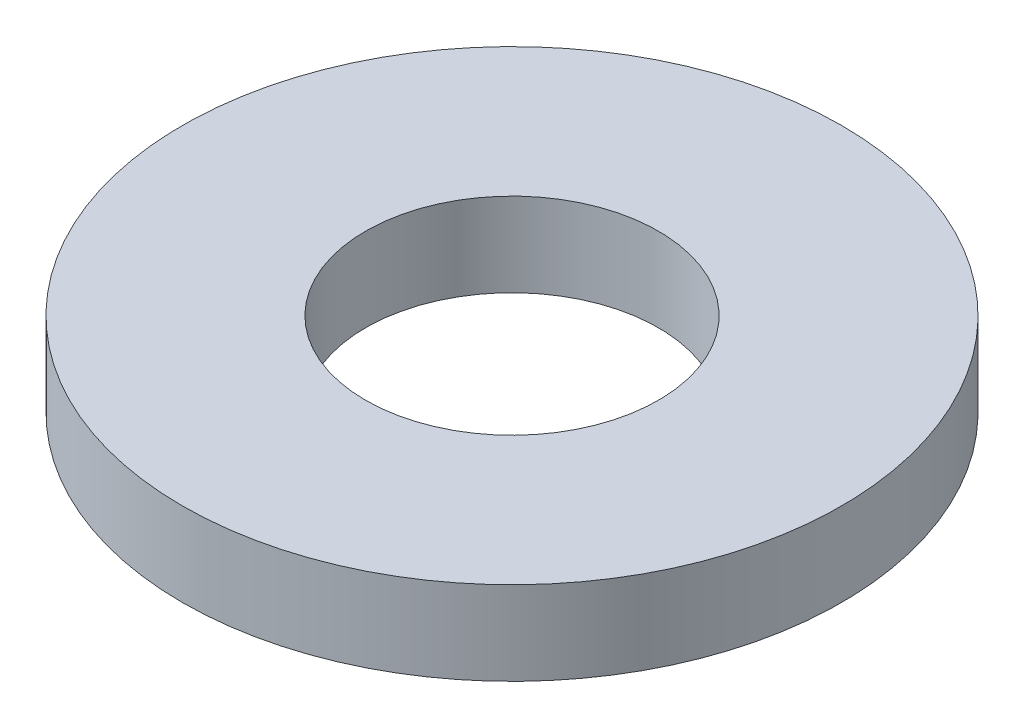
ISO-10303-21;
HEADER;
FILE_DESCRIPTION(('STEP AP214'),'2;1');
FILE_NAME('part.step','',(''),(''),'','','');
FILE_SCHEMA(('AUTOMOTIVE_DESIGN { 1 0 10303 214 1 1 1 1 }'));
ENDSEC;
DATA;
#1=APPLICATION_CONTEXT('core data for automotive mechanical design processes');
#2=APPLICATION_PROTOCOL_DEFINITION('international standard','automotive_design',2000,#1);
#3=PRODUCT_CONTEXT('',#1,'mechanical');
#4=PRODUCT('Part','Part','',(#3));
#5=PRODUCT_RELATED_PRODUCT_CATEGORY('part','',(#4));
#6=PRODUCT_DEFINITION_FORMATION('','',#4);
#7=PRODUCT_DEFINITION_CONTEXT('part definition',#1,'design');
#8=PRODUCT_DEFINITION('design','',#6,#7);
#9=PRODUCT_DEFINITION_SHAPE('','',#8);
#10=(LENGTH_UNIT() NAMED_UNIT(*) SI_UNIT(.MILLI.,.METRE.));
#11=(NAMED_UNIT(*) PLANE_ANGLE_UNIT() SI_UNIT($,.RADIAN.));
#12=(NAMED_UNIT(*) SI_UNIT($,.STERADIAN.) SOLID_ANGLE_UNIT());
#13=UNCERTAINTY_MEASURE_WITH_UNIT(LENGTH_MEASURE(1.E-05),#10,'distance_accuracy_value','');
#14=(GEOMETRIC_REPRESENTATION_CONTEXT(3) GLOBAL_UNCERTAINTY_ASSIGNED_CONTEXT((#13)) GLOBAL_UNIT_ASSIGNED_CONTEXT((#10,
#11,#12)) REPRESENTATION_CONTEXT('',''));
#15=CARTESIAN_POINT('',(0.,0.,0.));
#16=DIRECTION('',(0.,0.,1.));
#17=DIRECTION('',(1.,0.,0.));
#18=AXIS2_PLACEMENT_3D('',#15,#16,#17);
#19=CARTESIAN_POINT('',(0.,2.032,0.));
#20=DIRECTION('',(0.,-1.,0.));
#21=DIRECTION('',(0.,0.,-1.));
#22=AXIS2_PLACEMENT_3D('',#19,#20,#21);
#23=CYLINDRICAL_SURFACE('',#22,8.001);
#24=CARTESIAN_POINT('',(0.,2.032,0.));
#25=DIRECTION('',(0.,1.,0.));
#26=DIRECTION('',(0.,0.,1.));
#27=AXIS2_PLACEMENT_3D('',#24,#25,#26);
#28=CIRCLE('',#27,8.001);
#29=CARTESIAN_POINT('',(0.,2.032,8.001));
#30=VERTEX_POINT('',#29);
#31=EDGE_CURVE('E10',#30,#30,#28,.T.);
#32=ORIENTED_EDGE('',*,*,#31,.F.);
#33=EDGE_LOOP('',(#32));
#34=FACE_BOUND('',#33,.T.);
#35=CARTESIAN_POINT('',(0.,0.,0.));
#36=DIRECTION('',(0.,1.,0.));
#37=DIRECTION('',(0.,0.,1.));
#38=AXIS2_PLACEMENT_3D('',#35,#36,#37);
#39=CIRCLE('',#38,8.001);
#40=CARTESIAN_POINT('',(0.,0.,8.001));
#41=VERTEX_POINT('',#40);
#42=EDGE_CURVE('E36',#41,#41,#39,.T.);
#43=ORIENTED_EDGE('',*,*,#42,.T.);
#44=EDGE_LOOP('',(#43));
#45=FACE_BOUND('',#44,.T.);
#46=ADVANCED_FACE('F33',(#34,#45),#23,.T.);
#47=CARTESIAN_POINT('',(0.,2.032,0.));
#48=DIRECTION('',(0.,1.,0.));
#49=DIRECTION('',(0.,0.,1.));
#50=AXIS2_PLACEMENT_3D('',#47,#48,#49);
#51=PLANE('',#50);
#52=CARTESIAN_POINT('',(0.,2.032,0.));
#53=DIRECTION('',(0.,1.,0.));
#54=DIRECTION('',(0.,0.,1.));
#55=AXIS2_PLACEMENT_3D('',#52,#53,#54);
#56=CIRCLE('',#55,3.556);
#57=CARTESIAN_POINT('',(0.,2.032,3.556));
#58=VERTEX_POINT('',#57);
#59=EDGE_CURVE('E45',#58,#58,#56,.T.);
#60=ORIENTED_EDGE('',*,*,#59,.F.);
#61=EDGE_LOOP('',(#60));
#62=FACE_BOUND('',#61,.T.);
#63=ORIENTED_EDGE('',*,*,#31,.T.);
#64=EDGE_LOOP('',(#63));
#65=FACE_BOUND('',#64,.T.);
#66=ADVANCED_FACE('F60',(#62,#65),#51,.T.);
#67=CARTESIAN_POINT('',(0.,0.,0.));
#68=DIRECTION('',(0.,1.,0.));
#69=DIRECTION('',(0.,0.,1.));
#70=AXIS2_PLACEMENT_3D('',#67,#68,#69);
#71=PLANE('',#70);
#72=CARTESIAN_POINT('',(0.,0.,0.));
#73=DIRECTION('',(0.,1.,0.));
#74=DIRECTION('',(0.,0.,1.));
#75=AXIS2_PLACEMENT_3D('',#72,#73,#74);
#76=CIRCLE('',#75,3.556);
#77=CARTESIAN_POINT('',(0.,0.,3.556));
#78=VERTEX_POINT('',#77);
#79=EDGE_CURVE('E43',#78,#78,#76,.T.);
#80=ORIENTED_EDGE('',*,*,#79,.T.);
#81=EDGE_LOOP('',(#80));
#82=FACE_BOUND('',#81,.T.);
#83=ORIENTED_EDGE('',*,*,#42,.F.);
#84=EDGE_LOOP('',(#83));
#85=FACE_BOUND('',#84,.T.);
#86=ADVANCED_FACE('F51',(#82,#85),#71,.F.);
#87=CARTESIAN_POINT('',(0.,0.,0.));
#88=DIRECTION('',(0.,1.,0.));
#89=DIRECTION('',(0.,0.,1.));
#90=AXIS2_PLACEMENT_3D('',#87,#88,#89);
#91=CYLINDRICAL_SURFACE('',#90,3.556);
#92=ORIENTED_EDGE('',*,*,#79,.F.);
#93=EDGE_LOOP('',(#92));
#94=FACE_BOUND('',#93,.T.);
#95=ORIENTED_EDGE('',*,*,#59,.T.);
#96=EDGE_LOOP('',(#95));
#97=FACE_BOUND('',#96,.T.);
#98=ADVANCED_FACE('F54',(#94,#97),#91,.F.);
#99=CLOSED_SHELL('',(#46,#66,#86,#98));
#100=MANIFOLD_SOLID_BREP('B2',#99);
#101=ADVANCED_BREP_SHAPE_REPRESENTATION('',(#18,#100),#14);
#102=SHAPE_DEFINITION_REPRESENTATION(#9,#101);
ENDSEC;
END-ISO-10303-21;
